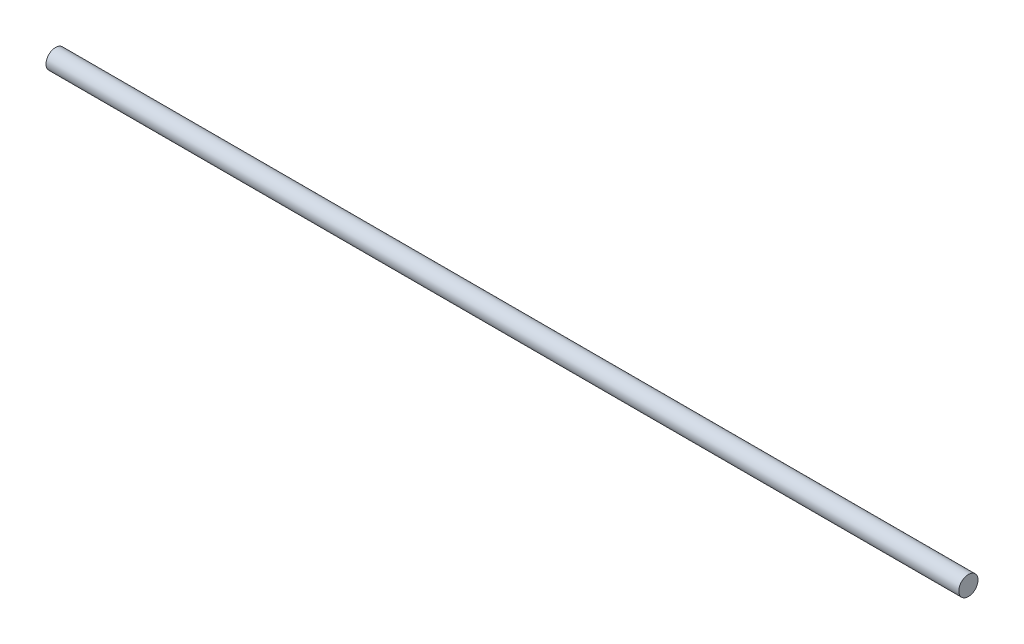
ISO-10303-21;
HEADER;
FILE_DESCRIPTION(('STEP AP214'),'2;1');
FILE_NAME('part.step','',(''),(''),'','','');
FILE_SCHEMA(('AUTOMOTIVE_DESIGN { 1 0 10303 214 1 1 1 1 }'));
ENDSEC;
DATA;
#1=APPLICATION_CONTEXT('core data for automotive mechanical design processes');
#2=APPLICATION_PROTOCOL_DEFINITION('international standard','automotive_design',2000,#1);
#3=PRODUCT_CONTEXT('',#1,'mechanical');
#4=PRODUCT('Part','Part','',(#3));
#5=PRODUCT_RELATED_PRODUCT_CATEGORY('part','',(#4));
#6=PRODUCT_DEFINITION_FORMATION('','',#4);
#7=PRODUCT_DEFINITION_CONTEXT('part definition',#1,'design');
#8=PRODUCT_DEFINITION('design','',#6,#7);
#9=PRODUCT_DEFINITION_SHAPE('','',#8);
#10=(LENGTH_UNIT() NAMED_UNIT(*) SI_UNIT(.MILLI.,.METRE.));
#11=(NAMED_UNIT(*) PLANE_ANGLE_UNIT() SI_UNIT($,.RADIAN.));
#12=(NAMED_UNIT(*) SI_UNIT($,.STERADIAN.) SOLID_ANGLE_UNIT());
#13=UNCERTAINTY_MEASURE_WITH_UNIT(LENGTH_MEASURE(1.E-05),#10,'distance_accuracy_value','');
#14=(GEOMETRIC_REPRESENTATION_CONTEXT(3) GLOBAL_UNCERTAINTY_ASSIGNED_CONTEXT((#13)) GLOBAL_UNIT_ASSIGNED_CONTEXT((#10,
#11,#12)) REPRESENTATION_CONTEXT('',''));
#15=CARTESIAN_POINT('',(0.,0.,0.));
#16=DIRECTION('',(0.,0.,1.));
#17=DIRECTION('',(1.,0.,0.));
#18=AXIS2_PLACEMENT_3D('',#15,#16,#17);
#19=CARTESIAN_POINT('',(1206.5,0.,0.));
#20=DIRECTION('',(-1.,0.,0.));
#21=DIRECTION('',(0.,0.,1.));
#22=AXIS2_PLACEMENT_3D('',#19,#20,#21);
#23=CYLINDRICAL_SURFACE('',#22,12.7);
#24=CARTESIAN_POINT('',(1206.5,0.,0.));
#25=DIRECTION('',(1.,0.,0.));
#26=DIRECTION('',(0.,0.,-1.));
#27=AXIS2_PLACEMENT_3D('',#24,#25,#26);
#28=CIRCLE('',#27,12.7);
#29=CARTESIAN_POINT('',(1206.5,0.,-12.7));
#30=VERTEX_POINT('',#29);
#31=EDGE_CURVE('E10',#30,#30,#28,.T.);
#32=ORIENTED_EDGE('',*,*,#31,.F.);
#33=EDGE_LOOP('',(#32));
#34=FACE_BOUND('',#33,.T.);
#35=CARTESIAN_POINT('',(0.,0.,0.));
#36=DIRECTION('',(1.,0.,0.));
#37=DIRECTION('',(0.,0.,-1.));
#38=AXIS2_PLACEMENT_3D('',#35,#36,#37);
#39=CIRCLE('',#38,12.7);
#40=CARTESIAN_POINT('',(0.,0.,-12.7));
#41=VERTEX_POINT('',#40);
#42=EDGE_CURVE('E44',#41,#41,#39,.T.);
#43=ORIENTED_EDGE('',*,*,#42,.T.);
#44=EDGE_LOOP('',(#43));
#45=FACE_BOUND('',#44,.T.);
#46=ADVANCED_FACE('F41',(#34,#45),#23,.T.);
#47=CARTESIAN_POINT('',(1206.5,0.,0.));
#48=DIRECTION('',(1.,0.,0.));
#49=DIRECTION('',(0.,0.,-1.));
#50=AXIS2_PLACEMENT_3D('',#47,#48,#49);
#51=PLANE('',#50);
#52=ORIENTED_EDGE('',*,*,#31,.T.);
#53=EDGE_LOOP('',(#52));
#54=FACE_BOUND('',#53,.T.);
#55=ADVANCED_FACE('F58',(#54),#51,.T.);
#56=CARTESIAN_POINT('',(0.,0.,0.));
#57=DIRECTION('',(1.,0.,0.));
#58=DIRECTION('',(0.,0.,-1.));
#59=AXIS2_PLACEMENT_3D('',#56,#57,#58);
#60=PLANE('',#59);
#61=ORIENTED_EDGE('',*,*,#42,.F.);
#62=EDGE_LOOP('',(#61));
#63=FACE_BOUND('',#62,.T.);
#64=ADVANCED_FACE('F56',(#63),#60,.F.);
#65=CLOSED_SHELL('',(#46,#55,#64));
#66=MANIFOLD_SOLID_BREP('B2',#65);
#67=ADVANCED_BREP_SHAPE_REPRESENTATION('',(#18,#66),#14);
#68=SHAPE_DEFINITION_REPRESENTATION(#9,#67);
ENDSEC;
END-ISO-10303-21;
